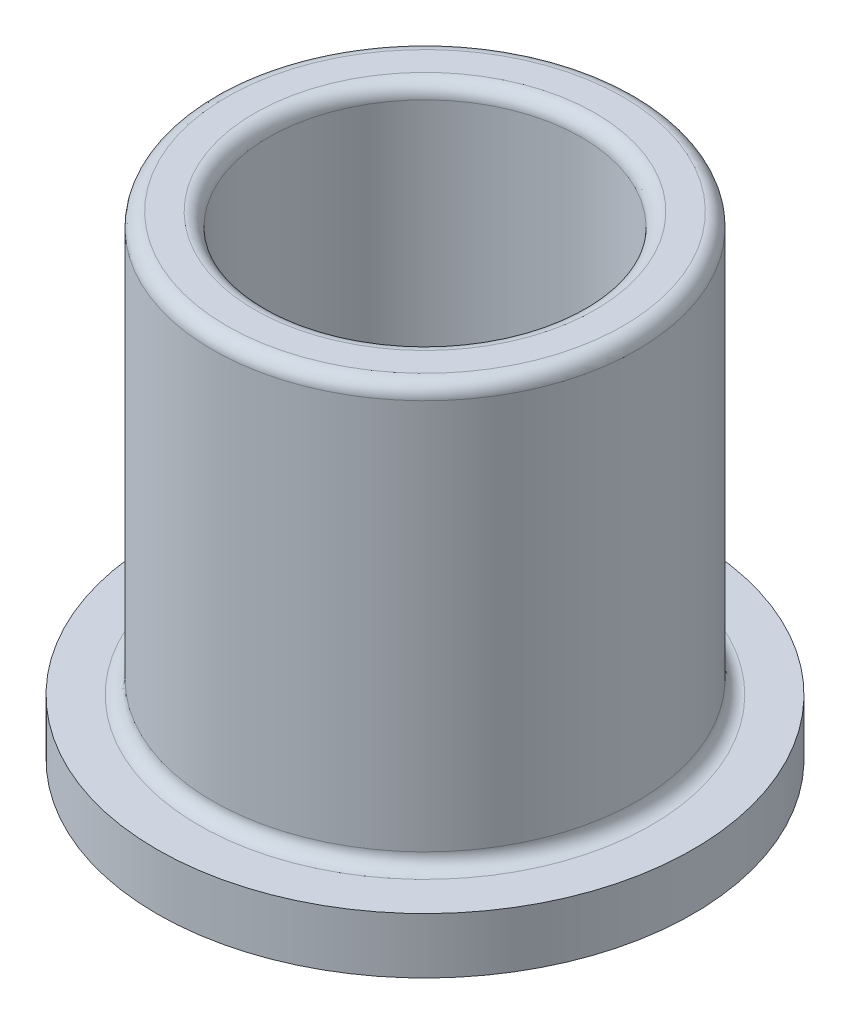
ISO-10303-21;
HEADER;
FILE_DESCRIPTION(('STEP AP214'),'2;1');
FILE_NAME('part.step','',(''),(''),'','','');
FILE_SCHEMA(('AUTOMOTIVE_DESIGN { 1 0 10303 214 1 1 1 1 }'));
ENDSEC;
DATA;
#1=APPLICATION_CONTEXT('core data for automotive mechanical design processes');
#2=APPLICATION_PROTOCOL_DEFINITION('international standard','automotive_design',2000,#1);
#3=PRODUCT_CONTEXT('',#1,'mechanical');
#4=PRODUCT('Part','Part','',(#3));
#5=PRODUCT_RELATED_PRODUCT_CATEGORY('part','',(#4));
#6=PRODUCT_DEFINITION_FORMATION('','',#4);
#7=PRODUCT_DEFINITION_CONTEXT('part definition',#1,'design');
#8=PRODUCT_DEFINITION('design','',#6,#7);
#9=PRODUCT_DEFINITION_SHAPE('','',#8);
#10=(LENGTH_UNIT() NAMED_UNIT(*) SI_UNIT(.MILLI.,.METRE.));
#11=(NAMED_UNIT(*) PLANE_ANGLE_UNIT() SI_UNIT($,.RADIAN.));
#12=(NAMED_UNIT(*) SI_UNIT($,.STERADIAN.) SOLID_ANGLE_UNIT());
#13=UNCERTAINTY_MEASURE_WITH_UNIT(LENGTH_MEASURE(1.E-05),#10,'distance_accuracy_value','');
#14=(GEOMETRIC_REPRESENTATION_CONTEXT(3) GLOBAL_UNCERTAINTY_ASSIGNED_CONTEXT((#13)) GLOBAL_UNIT_ASSIGNED_CONTEXT((#10,
#11,#12)) REPRESENTATION_CONTEXT('',''));
#15=CARTESIAN_POINT('',(0.,0.,0.));
#16=DIRECTION('',(0.,0.,1.));
#17=DIRECTION('',(1.,0.,0.));
#18=AXIS2_PLACEMENT_3D('',#15,#16,#17);
#19=CARTESIAN_POINT('',(48.2862566638139,12.7,0.));
#20=DIRECTION('',(0.,-1.,0.));
#21=DIRECTION('',(0.,0.,-1.));
#22=AXIS2_PLACEMENT_3D('',#19,#20,#21);
#23=PLANE('',#22);
#24=CARTESIAN_POINT('',(0.,12.7,0.));
#25=DIRECTION('',(0.,-1.,0.));
#26=DIRECTION('',(0.,0.,-1.));
#27=AXIS2_PLACEMENT_3D('',#24,#25,#26);
#28=CIRCLE('',#27,51.4612566638138);
#29=CARTESIAN_POINT('',(0.,12.7,-51.4612566638138));
#30=VERTEX_POINT('',#29);
#31=EDGE_CURVE('E44',#30,#30,#28,.T.);
#32=ORIENTED_EDGE('',*,*,#31,.T.);
#33=EDGE_LOOP('',(#32));
#34=FACE_BOUND('',#33,.T.);
#35=CARTESIAN_POINT('',(0.,12.7,0.));
#36=DIRECTION('',(0.,1.,0.));
#37=DIRECTION('',(0.,0.,1.));
#38=AXIS2_PLACEMENT_3D('',#35,#36,#37);
#39=CIRCLE('',#38,60.9862566638139);
#40=CARTESIAN_POINT('',(0.,12.7,60.9862566638139));
#41=VERTEX_POINT('',#40);
#42=EDGE_CURVE('E61',#41,#41,#39,.T.);
#43=ORIENTED_EDGE('',*,*,#42,.T.);
#44=EDGE_LOOP('',(#43));
#45=FACE_BOUND('',#44,.T.);
#46=ADVANCED_FACE('F29',(#34,#45),#23,.F.);
#47=CARTESIAN_POINT('',(0.,107.95,0.));
#48=DIRECTION('',(0.,1.,0.));
#49=DIRECTION('',(0.,0.,1.));
#50=AXIS2_PLACEMENT_3D('',#47,#48,#49);
#51=CYLINDRICAL_SURFACE('',#50,48.2862566638139);
#52=CARTESIAN_POINT('',(0.,15.875,0.));
#53=DIRECTION('',(0.,-1.,0.));
#54=DIRECTION('',(0.,0.,-1.));
#55=AXIS2_PLACEMENT_3D('',#52,#53,#54);
#56=CIRCLE('',#55,48.2862566638139);
#57=CARTESIAN_POINT('',(0.,15.875,-48.2862566638139));
#58=VERTEX_POINT('',#57);
#59=EDGE_CURVE('E49',#58,#58,#56,.F.);
#60=ORIENTED_EDGE('',*,*,#59,.T.);
#61=EDGE_LOOP('',(#60));
#62=FACE_BOUND('',#61,.T.);
#63=CARTESIAN_POINT('',(0.,104.775,0.));
#64=DIRECTION('',(0.,-1.,0.));
#65=DIRECTION('',(0.,0.,-1.));
#66=AXIS2_PLACEMENT_3D('',#63,#64,#65);
#67=CIRCLE('',#66,48.2862566638139);
#68=CARTESIAN_POINT('',(0.,104.775,-48.2862566638139));
#69=VERTEX_POINT('',#68);
#70=EDGE_CURVE('E52',#69,#69,#67,.T.);
#71=ORIENTED_EDGE('',*,*,#70,.T.);
#72=EDGE_LOOP('',(#71));
#73=FACE_BOUND('',#72,.T.);
#74=ADVANCED_FACE('F86',(#62,#73),#51,.T.);
#75=CARTESIAN_POINT('',(35.5862566638138,107.95,0.));
#76=DIRECTION('',(0.,-1.,0.));
#77=DIRECTION('',(0.,0.,-1.));
#78=AXIS2_PLACEMENT_3D('',#75,#76,#77);
#79=PLANE('',#78);
#80=CARTESIAN_POINT('',(0.,107.95,0.));
#81=DIRECTION('',(0.,-1.,0.));
#82=DIRECTION('',(0.,0.,-1.));
#83=AXIS2_PLACEMENT_3D('',#80,#81,#82);
#84=CIRCLE('',#83,45.1112566638139);
#85=CARTESIAN_POINT('',(0.,107.95,-45.1112566638139));
#86=VERTEX_POINT('',#85);
#87=EDGE_CURVE('E36',#86,#86,#84,.F.);
#88=ORIENTED_EDGE('',*,*,#87,.T.);
#89=EDGE_LOOP('',(#88));
#90=FACE_BOUND('',#89,.T.);
#91=CARTESIAN_POINT('',(0.,107.95,0.));
#92=DIRECTION('',(0.,-1.,0.));
#93=DIRECTION('',(0.,0.,-1.));
#94=AXIS2_PLACEMENT_3D('',#91,#92,#93);
#95=CIRCLE('',#94,38.7612566638138);
#96=CARTESIAN_POINT('',(0.,107.95,-38.7612566638138));
#97=VERTEX_POINT('',#96);
#98=EDGE_CURVE('E40',#97,#97,#95,.T.);
#99=ORIENTED_EDGE('',*,*,#98,.T.);
#100=EDGE_LOOP('',(#99));
#101=FACE_BOUND('',#100,.T.);
#102=ADVANCED_FACE('F81',(#90,#101),#79,.F.);
#103=CARTESIAN_POINT('',(0.,107.95,0.));
#104=DIRECTION('',(0.,1.,0.));
#105=DIRECTION('',(0.,0.,1.));
#106=AXIS2_PLACEMENT_3D('',#103,#104,#105);
#107=CYLINDRICAL_SURFACE('',#106,35.5862566638138);
#108=CARTESIAN_POINT('',(0.,104.775,0.));
#109=DIRECTION('',(0.,-1.,0.));
#110=DIRECTION('',(0.,0.,-1.));
#111=AXIS2_PLACEMENT_3D('',#108,#109,#110);
#112=CIRCLE('',#111,35.5862566638138);
#113=CARTESIAN_POINT('',(0.,104.775,-35.5862566638138));
#114=VERTEX_POINT('',#113);
#115=EDGE_CURVE('E10',#114,#114,#112,.F.);
#116=ORIENTED_EDGE('',*,*,#115,.T.);
#117=EDGE_LOOP('',(#116));
#118=FACE_BOUND('',#117,.T.);
#119=CARTESIAN_POINT('',(0.,0.,0.));
#120=DIRECTION('',(0.,1.,0.));
#121=DIRECTION('',(0.,0.,1.));
#122=AXIS2_PLACEMENT_3D('',#119,#120,#121);
#123=CIRCLE('',#122,35.5862566638138);
#124=CARTESIAN_POINT('',(0.,0.,35.5862566638138));
#125=VERTEX_POINT('',#124);
#126=EDGE_CURVE('E55',#125,#125,#123,.T.);
#127=ORIENTED_EDGE('',*,*,#126,.F.);
#128=EDGE_LOOP('',(#127));
#129=FACE_BOUND('',#128,.T.);
#130=ADVANCED_FACE('F76',(#118,#129),#107,.F.);
#131=CARTESIAN_POINT('',(35.5862566638138,0.,0.));
#132=DIRECTION('',(0.,1.,0.));
#133=DIRECTION('',(0.,0.,1.));
#134=AXIS2_PLACEMENT_3D('',#131,#132,#133);
#135=PLANE('',#134);
#136=CARTESIAN_POINT('',(0.,0.,0.));
#137=DIRECTION('',(0.,1.,0.));
#138=DIRECTION('',(0.,0.,1.));
#139=AXIS2_PLACEMENT_3D('',#136,#137,#138);
#140=CIRCLE('',#139,60.9862566638139);
#141=CARTESIAN_POINT('',(0.,0.,60.9862566638139));
#142=VERTEX_POINT('',#141);
#143=EDGE_CURVE('E58',#142,#142,#140,.T.);
#144=ORIENTED_EDGE('',*,*,#143,.F.);
#145=EDGE_LOOP('',(#144));
#146=FACE_BOUND('',#145,.T.);
#147=ORIENTED_EDGE('',*,*,#126,.T.);
#148=EDGE_LOOP('',(#147));
#149=FACE_BOUND('',#148,.T.);
#150=ADVANCED_FACE('F70',(#146,#149),#135,.F.);
#151=CARTESIAN_POINT('',(0.,107.95,0.));
#152=DIRECTION('',(0.,1.,0.));
#153=DIRECTION('',(0.,0.,1.));
#154=AXIS2_PLACEMENT_3D('',#151,#152,#153);
#155=CYLINDRICAL_SURFACE('',#154,60.9862566638139);
#156=ORIENTED_EDGE('',*,*,#42,.F.);
#157=EDGE_LOOP('',(#156));
#158=FACE_BOUND('',#157,.T.);
#159=ORIENTED_EDGE('',*,*,#143,.T.);
#160=EDGE_LOOP('',(#159));
#161=FACE_BOUND('',#160,.T.);
#162=ADVANCED_FACE('F66',(#158,#161),#155,.T.);
#163=CARTESIAN_POINT('',(0.,15.875,0.));
#164=DIRECTION('',(0.,-1.,0.));
#165=DIRECTION('',(0.,0.,-1.));
#166=AXIS2_PLACEMENT_3D('',#163,#164,#165);
#167=TOROIDAL_SURFACE('',#166,51.4612566638138,3.175);
#168=ORIENTED_EDGE('',*,*,#31,.F.);
#169=EDGE_LOOP('',(#168));
#170=FACE_BOUND('',#169,.T.);
#171=ORIENTED_EDGE('',*,*,#59,.F.);
#172=EDGE_LOOP('',(#171));
#173=FACE_BOUND('',#172,.T.);
#174=ADVANCED_FACE('F69',(#170,#173),#167,.F.);
#175=CARTESIAN_POINT('',(0.,104.775,0.));
#176=DIRECTION('',(0.,-1.,0.));
#177=DIRECTION('',(0.,0.,-1.));
#178=AXIS2_PLACEMENT_3D('',#175,#176,#177);
#179=TOROIDAL_SURFACE('',#178,45.1112566638139,3.175);
#180=ORIENTED_EDGE('',*,*,#70,.F.);
#181=EDGE_LOOP('',(#180));
#182=FACE_BOUND('',#181,.T.);
#183=ORIENTED_EDGE('',*,*,#87,.F.);
#184=EDGE_LOOP('',(#183));
#185=FACE_BOUND('',#184,.T.);
#186=ADVANCED_FACE('F98',(#182,#185),#179,.T.);
#187=CARTESIAN_POINT('',(0.,104.775,0.));
#188=DIRECTION('',(0.,-1.,0.));
#189=DIRECTION('',(0.,0.,-1.));
#190=AXIS2_PLACEMENT_3D('',#187,#188,#189);
#191=TOROIDAL_SURFACE('',#190,38.7612566638138,3.175);
#192=ORIENTED_EDGE('',*,*,#98,.F.);
#193=EDGE_LOOP('',(#192));
#194=FACE_BOUND('',#193,.T.);
#195=ORIENTED_EDGE('',*,*,#115,.F.);
#196=EDGE_LOOP('',(#195));
#197=FACE_BOUND('',#196,.T.);
#198=ADVANCED_FACE('F31',(#194,#197),#191,.T.);
#199=CLOSED_SHELL('',(#46,#74,#102,#130,#150,#162,#174,#186,#198));
#200=MANIFOLD_SOLID_BREP('B2',#199);
#201=ADVANCED_BREP_SHAPE_REPRESENTATION('',(#18,#200),#14);
#202=SHAPE_DEFINITION_REPRESENTATION(#9,#201);
ENDSEC;
END-ISO-10303-21;
